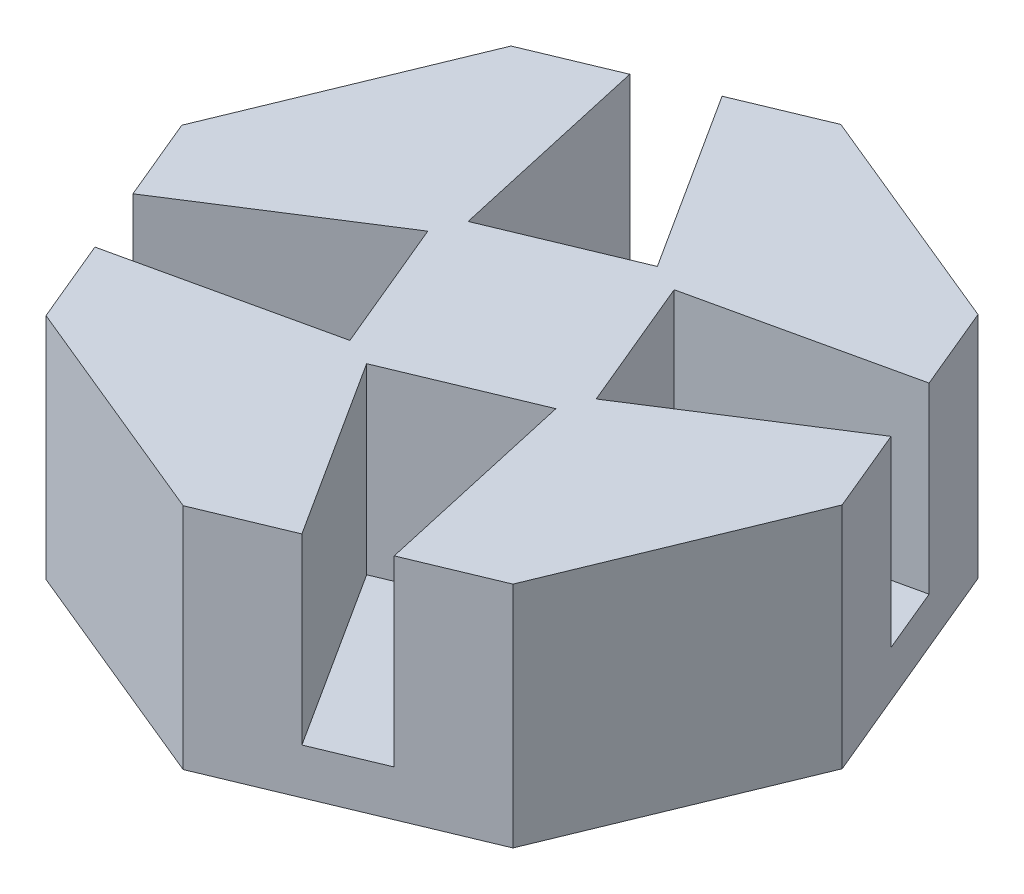
ISO-10303-21;
HEADER;
FILE_DESCRIPTION(('STEP AP214'),'2;1');
FILE_NAME('part.step','',(''),(''),'','','');
FILE_SCHEMA(('AUTOMOTIVE_DESIGN { 1 0 10303 214 1 1 1 1 }'));
ENDSEC;
DATA;
#1=APPLICATION_CONTEXT('core data for automotive mechanical design processes');
#2=APPLICATION_PROTOCOL_DEFINITION('international standard','automotive_design',2000,#1);
#3=PRODUCT_CONTEXT('',#1,'mechanical');
#4=PRODUCT('Part','Part','',(#3));
#5=PRODUCT_RELATED_PRODUCT_CATEGORY('part','',(#4));
#6=PRODUCT_DEFINITION_FORMATION('','',#4);
#7=PRODUCT_DEFINITION_CONTEXT('part definition',#1,'design');
#8=PRODUCT_DEFINITION('design','',#6,#7);
#9=PRODUCT_DEFINITION_SHAPE('','',#8);
#10=(LENGTH_UNIT() NAMED_UNIT(*) SI_UNIT(.MILLI.,.METRE.));
#11=(NAMED_UNIT(*) PLANE_ANGLE_UNIT() SI_UNIT($,.RADIAN.));
#12=(NAMED_UNIT(*) SI_UNIT($,.STERADIAN.) SOLID_ANGLE_UNIT());
#13=UNCERTAINTY_MEASURE_WITH_UNIT(LENGTH_MEASURE(1.E-05),#10,'distance_accuracy_value','');
#14=(GEOMETRIC_REPRESENTATION_CONTEXT(3) GLOBAL_UNCERTAINTY_ASSIGNED_CONTEXT((#13)) GLOBAL_UNIT_ASSIGNED_CONTEXT((#10,
#11,#12)) REPRESENTATION_CONTEXT('',''));
#15=CARTESIAN_POINT('',(0.,0.,0.));
#16=DIRECTION('',(0.,0.,1.));
#17=DIRECTION('',(1.,0.,0.));
#18=AXIS2_PLACEMENT_3D('',#15,#16,#17);
#19=CARTESIAN_POINT('',(-0.111992667325423,38.1,-54.9379232963896));
#20=DIRECTION('',(0.384565990508202,0.,0.923097502403969));
#21=DIRECTION('',(0.923097502403969,0.,-0.384565990508202));
#22=AXIS2_PLACEMENT_3D('',#19,#20,#21);
#23=PLANE('',#22);
#24=DIRECTION('',(0.,1.,0.));
#25=VECTOR('',#24,1.);
#26=CARTESIAN_POINT('',(-24.9509434148019,7.62000000000001,-44.5899203254017));
#27=LINE('',#26,#25);
#28=CARTESIAN_POINT('',(-24.9509434148019,7.62000000000001,-44.5899203254017));
#29=VERTEX_POINT('',#28);
#30=CARTESIAN_POINT('',(-24.9509434148019,38.1,-44.5899203254017));
#31=VERTEX_POINT('',#30);
#32=EDGE_CURVE('E248',#29,#31,#27,.T.);
#33=ORIENTED_EDGE('',*,*,#32,.F.);
#34=DIRECTION('',(-0.923097502403969,0.,0.384565990508202));
#35=VECTOR('',#34,1.);
#36=CARTESIAN_POINT('',(-19.5190807745089,7.62000000000001,-46.8528553145321));
#37=LINE('',#36,#35);
#38=CARTESIAN_POINT('',(-14.0872181342151,7.62000000000001,-49.1157903036627));
#39=VERTEX_POINT('',#38);
#40=EDGE_CURVE('E272',#39,#29,#37,.T.);
#41=ORIENTED_EDGE('',*,*,#40,.F.);
#42=DIRECTION('',(0.,1.,0.));
#43=VECTOR('',#42,1.);
#44=CARTESIAN_POINT('',(-14.0872181342151,7.62000000000001,-49.1157903036627));
#45=LINE('',#44,#43);
#46=CARTESIAN_POINT('',(-14.0872181342151,38.1,-49.1157903036627));
#47=VERTEX_POINT('',#46);
#48=EDGE_CURVE('E288',#39,#47,#45,.T.);
#49=ORIENTED_EDGE('',*,*,#48,.T.);
#50=DIRECTION('',(-0.923097502403969,0.,0.384565990508202));
#51=VECTOR('',#50,1.);
#52=CARTESIAN_POINT('',(-0.111992667325423,38.1,-54.9379232963896));
#53=LINE('',#52,#51);
#54=CARTESIAN_POINT('',(-0.111992667325423,38.1,-54.9379232963896));
#55=VERTEX_POINT('',#54);
#56=EDGE_CURVE('E379',#55,#47,#53,.T.);
#57=ORIENTED_EDGE('',*,*,#56,.F.);
#58=DIRECTION('',(0.,-1.,0.));
#59=VECTOR('',#58,1.);
#60=CARTESIAN_POINT('',(-0.111992667325423,38.1,-54.9379232963896));
#61=LINE('',#60,#59);
#62=CARTESIAN_POINT('',(-0.111992667325423,0.,-54.9379232963896));
#63=VERTEX_POINT('',#62);
#64=EDGE_CURVE('E11',#55,#63,#61,.T.);
#65=ORIENTED_EDGE('',*,*,#64,.T.);
#66=DIRECTION('',(-0.923097502403969,0.,0.384565990508202));
#67=VECTOR('',#66,1.);
#68=CARTESIAN_POINT('',(-0.111992667325423,0.,-54.9379232963896));
#69=LINE('',#68,#67);
#70=CARTESIAN_POINT('',(-38.9261688816924,0.,-38.7677873326745));
#71=VERTEX_POINT('',#70);
#72=EDGE_CURVE('E411',#63,#71,#69,.T.);
#73=ORIENTED_EDGE('',*,*,#72,.T.);
#74=DIRECTION('',(0.,-1.,0.));
#75=VECTOR('',#74,1.);
#76=CARTESIAN_POINT('',(-38.9261688816924,38.1,-38.7677873326745));
#77=LINE('',#76,#75);
#78=CARTESIAN_POINT('',(-38.9261688816924,38.1,-38.7677873326745));
#79=VERTEX_POINT('',#78);
#80=EDGE_CURVE('E54',#79,#71,#77,.T.);
#81=ORIENTED_EDGE('',*,*,#80,.F.);
#82=EDGE_CURVE('E377',#31,#79,#53,.T.);
#83=ORIENTED_EDGE('',*,*,#82,.F.);
#84=EDGE_LOOP('',(#33,#41,#49,#57,#65,#73,#81,#83));
#85=FACE_BOUND('',#84,.T.);
#86=ADVANCED_FACE('F45',(#85),#23,.F.);
#87=CARTESIAN_POINT('',(-54.9379232963896,38.1,0.111992667325427));
#88=DIRECTION('',(0.923097502403969,0.,-0.384565990508202));
#89=DIRECTION('',(-0.384565990508203,0.,-0.923097502403969));
#90=AXIS2_PLACEMENT_3D('',#87,#88,#89);
#91=PLANE('',#90);
#92=DIRECTION('',(0.,1.,0.));
#93=VECTOR('',#92,1.);
#94=CARTESIAN_POINT('',(-44.5899203254017,7.62000000000001,24.950943414802));
#95=LINE('',#94,#93);
#96=CARTESIAN_POINT('',(-44.5899203254017,7.62000000000001,24.950943414802));
#97=VERTEX_POINT('',#96);
#98=CARTESIAN_POINT('',(-44.5899203254017,38.1,24.950943414802));
#99=VERTEX_POINT('',#98);
#100=EDGE_CURVE('E251',#97,#99,#95,.T.);
#101=ORIENTED_EDGE('',*,*,#100,.F.);
#102=DIRECTION('',(0.384565990508203,0.,0.923097502403969));
#103=VECTOR('',#102,1.);
#104=CARTESIAN_POINT('',(-46.8528553145321,7.62000000000001,19.5190807745089));
#105=LINE('',#104,#103);
#106=CARTESIAN_POINT('',(-49.1157903036627,7.62000000000001,14.0872181342153));
#107=VERTEX_POINT('',#106);
#108=EDGE_CURVE('E230',#107,#97,#105,.T.);
#109=ORIENTED_EDGE('',*,*,#108,.F.);
#110=DIRECTION('',(0.,1.,0.));
#111=VECTOR('',#110,1.);
#112=CARTESIAN_POINT('',(-49.1157903036627,7.62000000000001,14.0872181342153));
#113=LINE('',#112,#111);
#114=CARTESIAN_POINT('',(-49.1157903036627,38.1,14.0872181342153));
#115=VERTEX_POINT('',#114);
#116=EDGE_CURVE('E255',#107,#115,#113,.T.);
#117=ORIENTED_EDGE('',*,*,#116,.T.);
#118=DIRECTION('',(0.384565990508203,0.,0.923097502403969));
#119=VECTOR('',#118,1.);
#120=CARTESIAN_POINT('',(-54.9379232963896,38.1,0.111992667325427));
#121=LINE('',#120,#119);
#122=CARTESIAN_POINT('',(-54.9379232963896,38.1,0.111992667325427));
#123=VERTEX_POINT('',#122);
#124=EDGE_CURVE('E387',#123,#115,#121,.T.);
#125=ORIENTED_EDGE('',*,*,#124,.F.);
#126=DIRECTION('',(0.,-1.,0.));
#127=VECTOR('',#126,1.);
#128=CARTESIAN_POINT('',(-54.9379232963896,38.1,0.111992667325427));
#129=LINE('',#128,#127);
#130=CARTESIAN_POINT('',(-54.9379232963896,0.,0.111992667325427));
#131=VERTEX_POINT('',#130);
#132=EDGE_CURVE('E450',#123,#131,#129,.T.);
#133=ORIENTED_EDGE('',*,*,#132,.T.);
#134=DIRECTION('',(0.384565990508203,0.,0.923097502403969));
#135=VECTOR('',#134,1.);
#136=CARTESIAN_POINT('',(-54.9379232963896,0.,0.111992667325427));
#137=LINE('',#136,#135);
#138=CARTESIAN_POINT('',(-38.7677873326745,0.,38.9261688816925));
#139=VERTEX_POINT('',#138);
#140=EDGE_CURVE('E417',#131,#139,#137,.T.);
#141=ORIENTED_EDGE('',*,*,#140,.T.);
#142=DIRECTION('',(0.,-1.,0.));
#143=VECTOR('',#142,1.);
#144=CARTESIAN_POINT('',(-38.7677873326745,38.1,38.9261688816925));
#145=LINE('',#144,#143);
#146=CARTESIAN_POINT('',(-38.7677873326745,38.1,38.9261688816925));
#147=VERTEX_POINT('',#146);
#148=EDGE_CURVE('E446',#147,#139,#145,.T.);
#149=ORIENTED_EDGE('',*,*,#148,.F.);
#150=EDGE_CURVE('E386',#99,#147,#121,.T.);
#151=ORIENTED_EDGE('',*,*,#150,.F.);
#152=EDGE_LOOP('',(#101,#109,#117,#125,#133,#141,#149,#151));
#153=FACE_BOUND('',#152,.T.);
#154=ADVANCED_FACE('F471',(#153),#91,.F.);
#155=CARTESIAN_POINT('',(0.111992667325429,38.1,54.9379232963896));
#156=DIRECTION('',(-0.384565990508203,0.,-0.923097502403969));
#157=DIRECTION('',(-0.923097502403969,0.,0.384565990508203));
#158=AXIS2_PLACEMENT_3D('',#155,#156,#157);
#159=PLANE('',#158);
#160=DIRECTION('',(0.,1.,0.));
#161=VECTOR('',#160,1.);
#162=CARTESIAN_POINT('',(24.9509434148022,7.62000000000001,44.5899203254016));
#163=LINE('',#162,#161);
#164=CARTESIAN_POINT('',(24.9509434148022,7.62000000000001,44.5899203254016));
#165=VERTEX_POINT('',#164);
#166=CARTESIAN_POINT('',(24.9509434148022,38.1,44.5899203254016));
#167=VERTEX_POINT('',#166);
#168=EDGE_CURVE('E363',#165,#167,#163,.T.);
#169=ORIENTED_EDGE('',*,*,#168,.F.);
#170=DIRECTION('',(0.923097502403969,0.,-0.384565990508203));
#171=VECTOR('',#170,1.);
#172=CARTESIAN_POINT('',(19.519080774509,7.62000000000001,46.8528553145321));
#173=LINE('',#172,#171);
#174=CARTESIAN_POINT('',(14.0872181342155,7.62000000000001,49.1157903036626));
#175=VERTEX_POINT('',#174);
#176=EDGE_CURVE('E341',#175,#165,#173,.T.);
#177=ORIENTED_EDGE('',*,*,#176,.F.);
#178=DIRECTION('',(0.,1.,0.));
#179=VECTOR('',#178,1.);
#180=CARTESIAN_POINT('',(14.0872181342155,7.62000000000001,49.1157903036626));
#181=LINE('',#180,#179);
#182=CARTESIAN_POINT('',(14.0872181342155,38.1,49.1157903036626));
#183=VERTEX_POINT('',#182);
#184=EDGE_CURVE('E366',#175,#183,#181,.T.);
#185=ORIENTED_EDGE('',*,*,#184,.T.);
#186=DIRECTION('',(0.923097502403969,0.,-0.384565990508203));
#187=VECTOR('',#186,1.);
#188=CARTESIAN_POINT('',(0.111992667325429,38.1,54.9379232963896));
#189=LINE('',#188,#187);
#190=CARTESIAN_POINT('',(0.111992667325429,38.1,54.9379232963896));
#191=VERTEX_POINT('',#190);
#192=EDGE_CURVE('E395',#191,#183,#189,.T.);
#193=ORIENTED_EDGE('',*,*,#192,.F.);
#194=DIRECTION('',(0.,-1.,0.));
#195=VECTOR('',#194,1.);
#196=CARTESIAN_POINT('',(0.111992667325429,38.1,54.9379232963896));
#197=LINE('',#196,#195);
#198=CARTESIAN_POINT('',(0.111992667325429,0.,54.9379232963896));
#199=VERTEX_POINT('',#198);
#200=EDGE_CURVE('E442',#191,#199,#197,.T.);
#201=ORIENTED_EDGE('',*,*,#200,.T.);
#202=DIRECTION('',(0.923097502403969,0.,-0.384565990508203));
#203=VECTOR('',#202,1.);
#204=CARTESIAN_POINT('',(0.111992667325429,0.,54.9379232963896));
#205=LINE('',#204,#203);
#206=CARTESIAN_POINT('',(38.9261688816925,0.,38.7677873326745));
#207=VERTEX_POINT('',#206);
#208=EDGE_CURVE('E423',#199,#207,#205,.T.);
#209=ORIENTED_EDGE('',*,*,#208,.T.);
#210=DIRECTION('',(0.,-1.,0.));
#211=VECTOR('',#210,1.);
#212=CARTESIAN_POINT('',(38.9261688816925,38.1,38.7677873326745));
#213=LINE('',#212,#211);
#214=CARTESIAN_POINT('',(38.9261688816925,38.1,38.7677873326745));
#215=VERTEX_POINT('',#214);
#216=EDGE_CURVE('E438',#215,#207,#213,.T.);
#217=ORIENTED_EDGE('',*,*,#216,.F.);
#218=EDGE_CURVE('E394',#167,#215,#189,.T.);
#219=ORIENTED_EDGE('',*,*,#218,.F.);
#220=EDGE_LOOP('',(#169,#177,#185,#193,#201,#209,#217,#219));
#221=FACE_BOUND('',#220,.T.);
#222=ADVANCED_FACE('F515',(#221),#159,.F.);
#223=CARTESIAN_POINT('',(54.9379232963896,38.1,-0.111992667325405));
#224=DIRECTION('',(-0.923097502403969,0.,0.384565990508202));
#225=DIRECTION('',(0.384565990508202,0.,0.923097502403969));
#226=AXIS2_PLACEMENT_3D('',#223,#224,#225);
#227=PLANE('',#226);
#228=DIRECTION('',(0.,1.,0.));
#229=VECTOR('',#228,1.);
#230=CARTESIAN_POINT('',(44.5899203254018,7.62000000000001,-24.9509434148017));
#231=LINE('',#230,#229);
#232=CARTESIAN_POINT('',(44.5899203254018,7.62000000000001,-24.9509434148017));
#233=VERTEX_POINT('',#232);
#234=CARTESIAN_POINT('',(44.5899203254018,38.1,-24.9509434148017));
#235=VERTEX_POINT('',#234);
#236=EDGE_CURVE('E280',#233,#235,#231,.T.);
#237=ORIENTED_EDGE('',*,*,#236,.F.);
#238=DIRECTION('',(-0.384565990508202,0.,-0.923097502403969));
#239=VECTOR('',#238,1.);
#240=CARTESIAN_POINT('',(46.8528553145321,7.62000000000001,-19.5190807745089));
#241=LINE('',#240,#239);
#242=CARTESIAN_POINT('',(49.1157903036628,7.62000000000001,-14.087218134215));
#243=VERTEX_POINT('',#242);
#244=EDGE_CURVE('E308',#243,#233,#241,.T.);
#245=ORIENTED_EDGE('',*,*,#244,.F.);
#246=DIRECTION('',(0.,1.,0.));
#247=VECTOR('',#246,1.);
#248=CARTESIAN_POINT('',(49.1157903036628,7.62000000000001,-14.087218134215));
#249=LINE('',#248,#247);
#250=CARTESIAN_POINT('',(49.1157903036628,38.1,-14.087218134215));
#251=VERTEX_POINT('',#250);
#252=EDGE_CURVE('E323',#243,#251,#249,.T.);
#253=ORIENTED_EDGE('',*,*,#252,.T.);
#254=DIRECTION('',(-0.384565990508202,0.,-0.923097502403969));
#255=VECTOR('',#254,1.);
#256=CARTESIAN_POINT('',(54.9379232963896,38.1,-0.111992667325405));
#257=LINE('',#256,#255);
#258=CARTESIAN_POINT('',(54.9379232963896,38.1,-0.111992667325405));
#259=VERTEX_POINT('',#258);
#260=EDGE_CURVE('E403',#259,#251,#257,.T.);
#261=ORIENTED_EDGE('',*,*,#260,.F.);
#262=DIRECTION('',(0.,-1.,0.));
#263=VECTOR('',#262,1.);
#264=CARTESIAN_POINT('',(54.9379232963896,38.1,-0.111992667325405));
#265=LINE('',#264,#263);
#266=CARTESIAN_POINT('',(54.9379232963896,0.,-0.111992667325405));
#267=VERTEX_POINT('',#266);
#268=EDGE_CURVE('E434',#259,#267,#265,.T.);
#269=ORIENTED_EDGE('',*,*,#268,.T.);
#270=DIRECTION('',(-0.384565990508202,0.,-0.923097502403969));
#271=VECTOR('',#270,1.);
#272=CARTESIAN_POINT('',(54.9379232963896,0.,-0.111992667325405));
#273=LINE('',#272,#271);
#274=CARTESIAN_POINT('',(38.7677873326746,0.,-38.9261688816924));
#275=VERTEX_POINT('',#274);
#276=EDGE_CURVE('E378',#267,#275,#273,.T.);
#277=ORIENTED_EDGE('',*,*,#276,.T.);
#278=DIRECTION('',(0.,-1.,0.));
#279=VECTOR('',#278,1.);
#280=CARTESIAN_POINT('',(38.7677873326746,38.1,-38.9261688816924));
#281=LINE('',#280,#279);
#282=CARTESIAN_POINT('',(38.7677873326746,38.1,-38.9261688816924));
#283=VERTEX_POINT('',#282);
#284=EDGE_CURVE('E407',#283,#275,#281,.T.);
#285=ORIENTED_EDGE('',*,*,#284,.F.);
#286=EDGE_CURVE('E402',#235,#283,#257,.T.);
#287=ORIENTED_EDGE('',*,*,#286,.F.);
#288=EDGE_LOOP('',(#237,#245,#253,#261,#269,#277,#285,#287));
#289=FACE_BOUND('',#288,.T.);
#290=ADVANCED_FACE('F505',(#289),#227,.F.);
#291=CARTESIAN_POINT('',(0.,38.1,0.));
#292=DIRECTION('',(0.,1.,0.));
#293=DIRECTION('',(0.,0.,1.));
#294=AXIS2_PLACEMENT_3D('',#291,#292,#293);
#295=PLANE('',#294);
#296=DIRECTION('',(-0.384565990508193,0.,-0.923097502403973));
#297=VECTOR('',#296,1.);
#298=CARTESIAN_POINT('',(14.4964416602682,38.1,-6.03927367521528));
#299=LINE('',#298,#297);
#300=CARTESIAN_POINT('',(19.1362303357496,38.1,5.09789769128866));
#301=VERTEX_POINT('',#300);
#302=CARTESIAN_POINT('',(9.85665298478688,38.1,-17.1764450417192));
#303=VERTEX_POINT('',#302);
#304=EDGE_CURVE('E315',#301,#303,#299,.T.);
#305=ORIENTED_EDGE('',*,*,#304,.T.);
#306=DIRECTION('',(0.975852760598064,0.,-0.218429369895939));
#307=VECTOR('',#306,1.);
#308=CARTESIAN_POINT('',(-3.19096887617111,38.1,-14.2559390629454));
#309=LINE('',#308,#307);
#310=EDGE_CURVE('E61',#303,#235,#309,.T.);
#311=ORIENTED_EDGE('',*,*,#310,.T.);
#312=ORIENTED_EDGE('',*,*,#286,.T.);
#313=DIRECTION('',(-0.924657723348283,0.,-0.38079928394414));
#314=VECTOR('',#313,1.);
#315=CARTESIAN_POINT('',(38.7677873326746,38.1,-38.9261688816924));
#316=LINE('',#315,#314);
#317=EDGE_CURVE('E373',#283,#55,#316,.T.);
#318=ORIENTED_EDGE('',*,*,#317,.T.);
#319=ORIENTED_EDGE('',*,*,#56,.T.);
#320=DIRECTION('',(-0.539017768098633,0.,-0.842294393709212));
#321=VECTOR('',#320,1.);
#322=CARTESIAN_POINT('',(12.3048251074475,38.1,-7.87434822764609));
#323=LINE('',#322,#321);
#324=CARTESIAN_POINT('',(5.09789769128859,38.1,-19.1362303357496));
#325=VERTEX_POINT('',#324);
#326=EDGE_CURVE('E265',#325,#47,#323,.T.);
#327=ORIENTED_EDGE('',*,*,#326,.F.);
#328=DIRECTION('',(-0.923097502403971,0.,0.384565990508196));
#329=VECTOR('',#328,1.);
#330=CARTESIAN_POINT('',(-6.03927367521533,38.1,-14.4964416602682));
#331=LINE('',#330,#329);
#332=CARTESIAN_POINT('',(-17.1764450417192,38.1,-9.85665298478682));
#333=VERTEX_POINT('',#332);
#334=EDGE_CURVE('E279',#325,#333,#331,.T.);
#335=ORIENTED_EDGE('',*,*,#334,.T.);
#336=DIRECTION('',(-0.218429369895943,0.,-0.975852760598064));
#337=VECTOR('',#336,1.);
#338=CARTESIAN_POINT('',(-14.2559390629454,38.1,3.19096887617116));
#339=LINE('',#338,#337);
#340=EDGE_CURVE('E69',#333,#31,#339,.T.);
#341=ORIENTED_EDGE('',*,*,#340,.T.);
#342=ORIENTED_EDGE('',*,*,#82,.T.);
#343=DIRECTION('',(-0.38079928394414,0.,0.924657723348283));
#344=VECTOR('',#343,1.);
#345=CARTESIAN_POINT('',(-38.9261688816924,38.1,-38.7677873326745));
#346=LINE('',#345,#344);
#347=EDGE_CURVE('E383',#79,#123,#346,.T.);
#348=ORIENTED_EDGE('',*,*,#347,.T.);
#349=ORIENTED_EDGE('',*,*,#124,.T.);
#350=DIRECTION('',(-0.84229439370921,0.,0.539017768098636));
#351=VECTOR('',#350,1.);
#352=CARTESIAN_POINT('',(-7.87434822764614,38.1,-12.3048251074475));
#353=LINE('',#352,#351);
#354=CARTESIAN_POINT('',(-19.1362303357496,38.1,-5.09789769128851));
#355=VERTEX_POINT('',#354);
#356=EDGE_CURVE('E236',#355,#115,#353,.T.);
#357=ORIENTED_EDGE('',*,*,#356,.F.);
#358=DIRECTION('',(0.384565990508199,0.,0.92309750240397));
#359=VECTOR('',#358,1.);
#360=CARTESIAN_POINT('',(-14.4964416602682,38.1,6.03927367521538));
#361=LINE('',#360,#359);
#362=CARTESIAN_POINT('',(-9.85665298478676,38.1,17.1764450417193));
#363=VERTEX_POINT('',#362);
#364=EDGE_CURVE('E239',#355,#363,#361,.T.);
#365=ORIENTED_EDGE('',*,*,#364,.T.);
#366=DIRECTION('',(-0.975852760598063,0.,0.218429369895946));
#367=VECTOR('',#366,1.);
#368=CARTESIAN_POINT('',(3.19096887617121,38.1,14.2559390629454));
#369=LINE('',#368,#367);
#370=EDGE_CURVE('E228',#363,#99,#369,.T.);
#371=ORIENTED_EDGE('',*,*,#370,.T.);
#372=ORIENTED_EDGE('',*,*,#150,.T.);
#373=DIRECTION('',(0.924657723348283,0.,0.38079928394414));
#374=VECTOR('',#373,1.);
#375=CARTESIAN_POINT('',(-38.7677873326745,38.1,38.9261688816925));
#376=LINE('',#375,#374);
#377=EDGE_CURVE('E391',#147,#191,#376,.T.);
#378=ORIENTED_EDGE('',*,*,#377,.T.);
#379=ORIENTED_EDGE('',*,*,#192,.T.);
#380=DIRECTION('',(0.539017768098639,0.,0.842294393709208));
#381=VECTOR('',#380,1.);
#382=CARTESIAN_POINT('',(-12.3048251074475,38.1,7.87434822764618));
#383=LINE('',#382,#381);
#384=CARTESIAN_POINT('',(-5.09789769128846,38.1,19.1362303357496));
#385=VERTEX_POINT('',#384);
#386=EDGE_CURVE('E352',#385,#183,#383,.T.);
#387=ORIENTED_EDGE('',*,*,#386,.F.);
#388=DIRECTION('',(0.923097502403969,0.,-0.384565990508203));
#389=VECTOR('',#388,1.);
#390=CARTESIAN_POINT('',(6.03927367521543,38.1,14.4964416602682));
#391=LINE('',#390,#389);
#392=CARTESIAN_POINT('',(17.1764450417193,38.1,9.8566529847867));
#393=VERTEX_POINT('',#392);
#394=EDGE_CURVE('E254',#385,#393,#391,.T.);
#395=ORIENTED_EDGE('',*,*,#394,.T.);
#396=DIRECTION('',(0.218429369895949,0.,0.975852760598062));
#397=VECTOR('',#396,1.);
#398=CARTESIAN_POINT('',(14.2559390629454,38.1,-3.19096887617126));
#399=LINE('',#398,#397);
#400=EDGE_CURVE('E337',#393,#167,#399,.T.);
#401=ORIENTED_EDGE('',*,*,#400,.T.);
#402=ORIENTED_EDGE('',*,*,#218,.T.);
#403=DIRECTION('',(0.38079928394414,0.,-0.924657723348283));
#404=VECTOR('',#403,1.);
#405=CARTESIAN_POINT('',(38.9261688816925,38.1,38.7677873326745));
#406=LINE('',#405,#404);
#407=EDGE_CURVE('E399',#215,#259,#406,.T.);
#408=ORIENTED_EDGE('',*,*,#407,.T.);
#409=ORIENTED_EDGE('',*,*,#260,.T.);
#410=DIRECTION('',(0.842294393709214,0.,-0.53901776809863));
#411=VECTOR('',#410,1.);
#412=CARTESIAN_POINT('',(7.87434822764605,38.1,12.3048251074475));
#413=LINE('',#412,#411);
#414=EDGE_CURVE('E301',#301,#251,#413,.T.);
#415=ORIENTED_EDGE('',*,*,#414,.F.);
#416=EDGE_LOOP('',(#305,#311,#312,#318,#319,#327,#335,#341,#342,#348,#349,#357,#365,#371,#372,
#378,#379,#387,#395,#401,#402,#408,#409,#415));
#417=FACE_BOUND('',#416,.T.);
#418=ADVANCED_FACE('F480',(#417),#295,.T.);
#419=CARTESIAN_POINT('',(38.7677873326746,38.1,-38.9261688816924));
#420=DIRECTION('',(-0.38079928394414,0.,0.924657723348283));
#421=DIRECTION('',(0.924657723348283,0.,0.38079928394414));
#422=AXIS2_PLACEMENT_3D('',#419,#420,#421);
#423=PLANE('',#422);
#424=DIRECTION('',(-0.924657723348283,0.,-0.38079928394414));
#425=VECTOR('',#424,1.);
#426=CARTESIAN_POINT('',(38.7677873326746,0.,-38.9261688816924));
#427=LINE('',#426,#425);
#428=EDGE_CURVE('E362',#275,#63,#427,.T.);
#429=ORIENTED_EDGE('',*,*,#428,.T.);
#430=ORIENTED_EDGE('',*,*,#64,.F.);
#431=ORIENTED_EDGE('',*,*,#317,.F.);
#432=ORIENTED_EDGE('',*,*,#284,.T.);
#433=EDGE_LOOP('',(#429,#430,#431,#432));
#434=FACE_BOUND('',#433,.T.);
#435=ADVANCED_FACE('F47',(#434),#423,.F.);
#436=CARTESIAN_POINT('',(-38.9261688816924,38.1,-38.7677873326745));
#437=DIRECTION('',(0.924657723348283,0.,0.38079928394414));
#438=DIRECTION('',(0.38079928394414,0.,-0.924657723348283));
#439=AXIS2_PLACEMENT_3D('',#436,#437,#438);
#440=PLANE('',#439);
#441=DIRECTION('',(-0.38079928394414,0.,0.924657723348283));
#442=VECTOR('',#441,1.);
#443=CARTESIAN_POINT('',(-38.9261688816924,0.,-38.7677873326745));
#444=LINE('',#443,#442);
#445=EDGE_CURVE('E414',#71,#131,#444,.T.);
#446=ORIENTED_EDGE('',*,*,#445,.T.);
#447=ORIENTED_EDGE('',*,*,#132,.F.);
#448=ORIENTED_EDGE('',*,*,#347,.F.);
#449=ORIENTED_EDGE('',*,*,#80,.T.);
#450=EDGE_LOOP('',(#446,#447,#448,#449));
#451=FACE_BOUND('',#450,.T.);
#452=ADVANCED_FACE('F459',(#451),#440,.F.);
#453=CARTESIAN_POINT('',(-38.7677873326745,38.1,38.9261688816925));
#454=DIRECTION('',(0.38079928394414,0.,-0.924657723348283));
#455=DIRECTION('',(-0.924657723348283,0.,-0.38079928394414));
#456=AXIS2_PLACEMENT_3D('',#453,#454,#455);
#457=PLANE('',#456);
#458=DIRECTION('',(0.924657723348283,0.,0.38079928394414));
#459=VECTOR('',#458,1.);
#460=CARTESIAN_POINT('',(-38.7677873326745,0.,38.9261688816925));
#461=LINE('',#460,#459);
#462=EDGE_CURVE('E420',#139,#199,#461,.T.);
#463=ORIENTED_EDGE('',*,*,#462,.T.);
#464=ORIENTED_EDGE('',*,*,#200,.F.);
#465=ORIENTED_EDGE('',*,*,#377,.F.);
#466=ORIENTED_EDGE('',*,*,#148,.T.);
#467=EDGE_LOOP('',(#463,#464,#465,#466));
#468=FACE_BOUND('',#467,.T.);
#469=ADVANCED_FACE('F476',(#468),#457,.F.);
#470=CARTESIAN_POINT('',(38.9261688816925,38.1,38.7677873326745));
#471=DIRECTION('',(-0.924657723348283,0.,-0.38079928394414));
#472=DIRECTION('',(-0.38079928394414,0.,0.924657723348283));
#473=AXIS2_PLACEMENT_3D('',#470,#471,#472);
#474=PLANE('',#473);
#475=DIRECTION('',(0.38079928394414,0.,-0.924657723348283));
#476=VECTOR('',#475,1.);
#477=CARTESIAN_POINT('',(38.9261688816925,0.,38.7677873326745));
#478=LINE('',#477,#476);
#479=EDGE_CURVE('E426',#207,#267,#478,.T.);
#480=ORIENTED_EDGE('',*,*,#479,.T.);
#481=ORIENTED_EDGE('',*,*,#268,.F.);
#482=ORIENTED_EDGE('',*,*,#407,.F.);
#483=ORIENTED_EDGE('',*,*,#216,.T.);
#484=EDGE_LOOP('',(#480,#481,#482,#483));
#485=FACE_BOUND('',#484,.T.);
#486=ADVANCED_FACE('F510',(#485),#474,.F.);
#487=CARTESIAN_POINT('',(0.,0.,0.));
#488=DIRECTION('',(0.,1.,0.));
#489=DIRECTION('',(0.,0.,1.));
#490=AXIS2_PLACEMENT_3D('',#487,#488,#489);
#491=PLANE('',#490);
#492=ORIENTED_EDGE('',*,*,#428,.F.);
#493=ORIENTED_EDGE('',*,*,#276,.F.);
#494=ORIENTED_EDGE('',*,*,#479,.F.);
#495=ORIENTED_EDGE('',*,*,#208,.F.);
#496=ORIENTED_EDGE('',*,*,#462,.F.);
#497=ORIENTED_EDGE('',*,*,#140,.F.);
#498=ORIENTED_EDGE('',*,*,#445,.F.);
#499=ORIENTED_EDGE('',*,*,#72,.F.);
#500=EDGE_LOOP('',(#492,#493,#494,#495,#496,#497,#498,#499));
#501=FACE_BOUND('',#500,.T.);
#502=ADVANCED_FACE('F466',(#501),#491,.F.);
#503=CARTESIAN_POINT('',(6.03927367521543,7.62000000000001,14.4964416602682));
#504=DIRECTION('',(0.384565990508203,0.,0.923097502403969));
#505=DIRECTION('',(0.923097502403969,0.,-0.384565990508203));
#506=AXIS2_PLACEMENT_3D('',#503,#504,#505);
#507=PLANE('',#506);
#508=ORIENTED_EDGE('',*,*,#394,.F.);
#509=DIRECTION('',(0.,1.,0.));
#510=VECTOR('',#509,1.);
#511=CARTESIAN_POINT('',(-5.09789769128845,7.62000000000001,19.1362303357496));
#512=LINE('',#511,#510);
#513=CARTESIAN_POINT('',(-5.09789769128845,7.62000000000001,19.1362303357496));
#514=VERTEX_POINT('',#513);
#515=EDGE_CURVE('E348',#514,#385,#512,.T.);
#516=ORIENTED_EDGE('',*,*,#515,.F.);
#517=DIRECTION('',(0.923097502403969,0.,-0.384565990508203));
#518=VECTOR('',#517,1.);
#519=CARTESIAN_POINT('',(6.03927367521543,7.62000000000001,14.4964416602682));
#520=LINE('',#519,#518);
#521=CARTESIAN_POINT('',(17.1764450417193,7.62000000000001,9.8566529847867));
#522=VERTEX_POINT('',#521);
#523=EDGE_CURVE('E332',#514,#522,#520,.T.);
#524=ORIENTED_EDGE('',*,*,#523,.T.);
#525=DIRECTION('',(0.,1.,0.));
#526=VECTOR('',#525,1.);
#527=CARTESIAN_POINT('',(17.1764450417193,7.62000000000001,9.8566529847867));
#528=LINE('',#527,#526);
#529=EDGE_CURVE('E358',#522,#393,#528,.T.);
#530=ORIENTED_EDGE('',*,*,#529,.T.);
#531=EDGE_LOOP('',(#508,#516,#524,#530));
#532=FACE_BOUND('',#531,.T.);
#533=ADVANCED_FACE('F525',(#532),#507,.T.);
#534=CARTESIAN_POINT('',(14.2559390629454,7.62000000000001,-3.19096887617126));
#535=DIRECTION('',(-0.975852760598062,0.,0.218429369895949));
#536=DIRECTION('',(0.218429369895949,0.,0.975852760598062));
#537=AXIS2_PLACEMENT_3D('',#534,#535,#536);
#538=PLANE('',#537);
#539=ORIENTED_EDGE('',*,*,#400,.F.);
#540=ORIENTED_EDGE('',*,*,#529,.F.);
#541=DIRECTION('',(0.218429369895949,0.,0.975852760598062));
#542=VECTOR('',#541,1.);
#543=CARTESIAN_POINT('',(14.2559390629454,7.62000000000001,-3.19096887617126));
#544=LINE('',#543,#542);
#545=EDGE_CURVE('E345',#522,#165,#544,.T.);
#546=ORIENTED_EDGE('',*,*,#545,.T.);
#547=ORIENTED_EDGE('',*,*,#168,.T.);
#548=EDGE_LOOP('',(#539,#540,#546,#547));
#549=FACE_BOUND('',#548,.T.);
#550=ADVANCED_FACE('F527',(#549),#538,.T.);
#551=CARTESIAN_POINT('',(-12.3048251074475,7.62000000000001,7.87434822764618));
#552=DIRECTION('',(-0.842294393709208,0.,0.539017768098639));
#553=DIRECTION('',(0.539017768098639,0.,0.842294393709208));
#554=AXIS2_PLACEMENT_3D('',#551,#552,#553);
#555=PLANE('',#554);
#556=ORIENTED_EDGE('',*,*,#386,.T.);
#557=ORIENTED_EDGE('',*,*,#184,.F.);
#558=DIRECTION('',(0.539017768098639,0.,0.842294393709208));
#559=VECTOR('',#558,1.);
#560=CARTESIAN_POINT('',(-12.3048251074475,7.62000000000001,7.87434822764618));
#561=LINE('',#560,#559);
#562=EDGE_CURVE('E336',#514,#175,#561,.T.);
#563=ORIENTED_EDGE('',*,*,#562,.F.);
#564=ORIENTED_EDGE('',*,*,#515,.T.);
#565=EDGE_LOOP('',(#556,#557,#563,#564));
#566=FACE_BOUND('',#565,.T.);
#567=ADVANCED_FACE('F519',(#566),#555,.F.);
#568=CARTESIAN_POINT('',(0.,7.62000000000001,0.));
#569=DIRECTION('',(0.,1.,0.));
#570=DIRECTION('',(0.,0.,1.));
#571=AXIS2_PLACEMENT_3D('',#568,#569,#570);
#572=PLANE('',#571);
#573=ORIENTED_EDGE('',*,*,#523,.F.);
#574=ORIENTED_EDGE('',*,*,#562,.T.);
#575=ORIENTED_EDGE('',*,*,#176,.T.);
#576=ORIENTED_EDGE('',*,*,#545,.F.);
#577=EDGE_LOOP('',(#573,#574,#575,#576));
#578=FACE_BOUND('',#577,.T.);
#579=ADVANCED_FACE('F522',(#578),#572,.T.);
#580=CARTESIAN_POINT('',(3.19096887617121,7.62000000000001,14.2559390629454));
#581=DIRECTION('',(-0.218429369895946,0.,-0.975852760598063));
#582=DIRECTION('',(-0.975852760598063,0.,0.218429369895946));
#583=AXIS2_PLACEMENT_3D('',#580,#581,#582);
#584=PLANE('',#583);
#585=ORIENTED_EDGE('',*,*,#370,.F.);
#586=DIRECTION('',(0.,1.,0.));
#587=VECTOR('',#586,1.);
#588=CARTESIAN_POINT('',(-9.85665298478676,7.62000000000001,17.1764450417193));
#589=LINE('',#588,#587);
#590=CARTESIAN_POINT('',(-9.85665298478676,7.62000000000001,17.1764450417193));
#591=VERTEX_POINT('',#590);
#592=EDGE_CURVE('E213',#591,#363,#589,.T.);
#593=ORIENTED_EDGE('',*,*,#592,.F.);
#594=DIRECTION('',(-0.975852760598063,0.,0.218429369895946));
#595=VECTOR('',#594,1.);
#596=CARTESIAN_POINT('',(3.19096887617121,7.62000000000001,14.2559390629454));
#597=LINE('',#596,#595);
#598=EDGE_CURVE('E222',#591,#97,#597,.T.);
#599=ORIENTED_EDGE('',*,*,#598,.T.);
#600=ORIENTED_EDGE('',*,*,#100,.T.);
#601=EDGE_LOOP('',(#585,#593,#599,#600));
#602=FACE_BOUND('',#601,.T.);
#603=ADVANCED_FACE('F225',(#602),#584,.T.);
#604=CARTESIAN_POINT('',(-7.87434822764614,7.62000000000001,-12.3048251074475));
#605=DIRECTION('',(-0.539017768098636,0.,-0.84229439370921));
#606=DIRECTION('',(-0.84229439370921,0.,0.539017768098636));
#607=AXIS2_PLACEMENT_3D('',#604,#605,#606);
#608=PLANE('',#607);
#609=ORIENTED_EDGE('',*,*,#356,.T.);
#610=ORIENTED_EDGE('',*,*,#116,.F.);
#611=DIRECTION('',(-0.84229439370921,0.,0.539017768098636));
#612=VECTOR('',#611,1.);
#613=CARTESIAN_POINT('',(-7.87434822764614,7.62000000000001,-12.3048251074475));
#614=LINE('',#613,#612);
#615=CARTESIAN_POINT('',(-19.1362303357496,7.62000000000001,-5.09789769128851));
#616=VERTEX_POINT('',#615);
#617=EDGE_CURVE('E221',#616,#107,#614,.T.);
#618=ORIENTED_EDGE('',*,*,#617,.F.);
#619=DIRECTION('',(0.,1.,0.));
#620=VECTOR('',#619,1.);
#621=CARTESIAN_POINT('',(-19.1362303357496,7.62000000000001,-5.09789769128851));
#622=LINE('',#621,#620);
#623=EDGE_CURVE('E215',#616,#355,#622,.T.);
#624=ORIENTED_EDGE('',*,*,#623,.T.);
#625=EDGE_LOOP('',(#609,#610,#618,#624));
#626=FACE_BOUND('',#625,.T.);
#627=ADVANCED_FACE('F583',(#626),#608,.F.);
#628=CARTESIAN_POINT('',(-14.4964416602682,7.62000000000001,6.03927367521538));
#629=DIRECTION('',(-0.92309750240397,0.,0.384565990508199));
#630=DIRECTION('',(0.384565990508199,0.,0.92309750240397));
#631=AXIS2_PLACEMENT_3D('',#628,#629,#630);
#632=PLANE('',#631);
#633=ORIENTED_EDGE('',*,*,#364,.F.);
#634=ORIENTED_EDGE('',*,*,#623,.F.);
#635=DIRECTION('',(0.384565990508199,0.,0.92309750240397));
#636=VECTOR('',#635,1.);
#637=CARTESIAN_POINT('',(-14.4964416602682,7.62000000000001,6.03927367521538));
#638=LINE('',#637,#636);
#639=EDGE_CURVE('E209',#616,#591,#638,.T.);
#640=ORIENTED_EDGE('',*,*,#639,.T.);
#641=ORIENTED_EDGE('',*,*,#592,.T.);
#642=EDGE_LOOP('',(#633,#634,#640,#641));
#643=FACE_BOUND('',#642,.T.);
#644=ADVANCED_FACE('F212',(#643),#632,.T.);
#645=CARTESIAN_POINT('',(0.,7.62000000000001,0.));
#646=DIRECTION('',(0.,1.,0.));
#647=DIRECTION('',(0.,0.,1.));
#648=AXIS2_PLACEMENT_3D('',#645,#646,#647);
#649=PLANE('',#648);
#650=ORIENTED_EDGE('',*,*,#598,.F.);
#651=ORIENTED_EDGE('',*,*,#639,.F.);
#652=ORIENTED_EDGE('',*,*,#617,.T.);
#653=ORIENTED_EDGE('',*,*,#108,.T.);
#654=EDGE_LOOP('',(#650,#651,#652,#653));
#655=FACE_BOUND('',#654,.T.);
#656=ADVANCED_FACE('F232',(#655),#649,.T.);
#657=CARTESIAN_POINT('',(-14.2559390629454,7.62000000000001,3.19096887617116));
#658=DIRECTION('',(0.975852760598063,0.,-0.218429369895943));
#659=DIRECTION('',(-0.218429369895943,0.,-0.975852760598063));
#660=AXIS2_PLACEMENT_3D('',#657,#658,#659);
#661=PLANE('',#660);
#662=ORIENTED_EDGE('',*,*,#340,.F.);
#663=DIRECTION('',(0.,1.,0.));
#664=VECTOR('',#663,1.);
#665=CARTESIAN_POINT('',(-17.1764450417192,7.62000000000001,-9.85665298478681));
#666=LINE('',#665,#664);
#667=CARTESIAN_POINT('',(-17.1764450417192,7.62000000000001,-9.85665298478681));
#668=VERTEX_POINT('',#667);
#669=EDGE_CURVE('E276',#668,#333,#666,.T.);
#670=ORIENTED_EDGE('',*,*,#669,.F.);
#671=DIRECTION('',(-0.218429369895943,0.,-0.975852760598064));
#672=VECTOR('',#671,1.);
#673=CARTESIAN_POINT('',(-14.2559390629454,7.62000000000001,3.19096887617116));
#674=LINE('',#673,#672);
#675=EDGE_CURVE('E261',#668,#29,#674,.T.);
#676=ORIENTED_EDGE('',*,*,#675,.T.);
#677=ORIENTED_EDGE('',*,*,#32,.T.);
#678=EDGE_LOOP('',(#662,#670,#676,#677));
#679=FACE_BOUND('',#678,.T.);
#680=ADVANCED_FACE('F486',(#679),#661,.T.);
#681=CARTESIAN_POINT('',(12.3048251074475,7.62000000000001,-7.87434822764609));
#682=DIRECTION('',(0.842294393709212,0.,-0.539017768098633));
#683=DIRECTION('',(-0.539017768098633,0.,-0.842294393709212));
#684=AXIS2_PLACEMENT_3D('',#681,#682,#683);
#685=PLANE('',#684);
#686=ORIENTED_EDGE('',*,*,#326,.T.);
#687=ORIENTED_EDGE('',*,*,#48,.F.);
#688=DIRECTION('',(-0.539017768098633,0.,-0.842294393709212));
#689=VECTOR('',#688,1.);
#690=CARTESIAN_POINT('',(12.3048251074475,7.62000000000001,-7.87434822764609));
#691=LINE('',#690,#689);
#692=CARTESIAN_POINT('',(5.09789769128859,7.62000000000001,-19.1362303357496));
#693=VERTEX_POINT('',#692);
#694=EDGE_CURVE('E268',#693,#39,#691,.T.);
#695=ORIENTED_EDGE('',*,*,#694,.F.);
#696=DIRECTION('',(0.,1.,0.));
#697=VECTOR('',#696,1.);
#698=CARTESIAN_POINT('',(5.09789769128859,7.62000000000001,-19.1362303357496));
#699=LINE('',#698,#697);
#700=EDGE_CURVE('E292',#693,#325,#699,.T.);
#701=ORIENTED_EDGE('',*,*,#700,.T.);
#702=EDGE_LOOP('',(#686,#687,#695,#701));
#703=FACE_BOUND('',#702,.T.);
#704=ADVANCED_FACE('F493',(#703),#685,.F.);
#705=CARTESIAN_POINT('',(-6.03927367521533,7.62000000000001,-14.4964416602682));
#706=DIRECTION('',(-0.384565990508196,0.,-0.923097502403971));
#707=DIRECTION('',(-0.923097502403971,0.,0.384565990508196));
#708=AXIS2_PLACEMENT_3D('',#705,#706,#707);
#709=PLANE('',#708);
#710=ORIENTED_EDGE('',*,*,#334,.F.);
#711=ORIENTED_EDGE('',*,*,#700,.F.);
#712=DIRECTION('',(-0.923097502403971,0.,0.384565990508196));
#713=VECTOR('',#712,1.);
#714=CARTESIAN_POINT('',(-6.03927367521533,7.62000000000001,-14.4964416602682));
#715=LINE('',#714,#713);
#716=EDGE_CURVE('E264',#693,#668,#715,.T.);
#717=ORIENTED_EDGE('',*,*,#716,.T.);
#718=ORIENTED_EDGE('',*,*,#669,.T.);
#719=EDGE_LOOP('',(#710,#711,#717,#718));
#720=FACE_BOUND('',#719,.T.);
#721=ADVANCED_FACE('F550',(#720),#709,.T.);
#722=CARTESIAN_POINT('',(0.,7.62000000000001,0.));
#723=DIRECTION('',(0.,1.,0.));
#724=DIRECTION('',(0.,0.,1.));
#725=AXIS2_PLACEMENT_3D('',#722,#723,#724);
#726=PLANE('',#725);
#727=ORIENTED_EDGE('',*,*,#675,.F.);
#728=ORIENTED_EDGE('',*,*,#716,.F.);
#729=ORIENTED_EDGE('',*,*,#694,.T.);
#730=ORIENTED_EDGE('',*,*,#40,.T.);
#731=EDGE_LOOP('',(#727,#728,#729,#730));
#732=FACE_BOUND('',#731,.T.);
#733=ADVANCED_FACE('F490',(#732),#726,.T.);
#734=CARTESIAN_POINT('',(-3.19096887617111,7.62000000000001,-14.2559390629454));
#735=DIRECTION('',(0.218429369895939,0.,0.975852760598064));
#736=DIRECTION('',(0.975852760598064,0.,-0.218429369895939));
#737=AXIS2_PLACEMENT_3D('',#734,#735,#736);
#738=PLANE('',#737);
#739=ORIENTED_EDGE('',*,*,#310,.F.);
#740=DIRECTION('',(0.,1.,0.));
#741=VECTOR('',#740,1.);
#742=CARTESIAN_POINT('',(9.85665298478688,7.62000000000001,-17.1764450417192));
#743=LINE('',#742,#741);
#744=CARTESIAN_POINT('',(9.85665298478688,7.62000000000001,-17.1764450417192));
#745=VERTEX_POINT('',#744);
#746=EDGE_CURVE('E312',#745,#303,#743,.T.);
#747=ORIENTED_EDGE('',*,*,#746,.F.);
#748=DIRECTION('',(0.975852760598064,0.,-0.218429369895939));
#749=VECTOR('',#748,1.);
#750=CARTESIAN_POINT('',(-3.19096887617111,7.62000000000001,-14.2559390629454));
#751=LINE('',#750,#749);
#752=EDGE_CURVE('E297',#745,#233,#751,.T.);
#753=ORIENTED_EDGE('',*,*,#752,.T.);
#754=ORIENTED_EDGE('',*,*,#236,.T.);
#755=EDGE_LOOP('',(#739,#747,#753,#754));
#756=FACE_BOUND('',#755,.T.);
#757=ADVANCED_FACE('F542',(#756),#738,.T.);
#758=CARTESIAN_POINT('',(7.87434822764605,7.62000000000001,12.3048251074475));
#759=DIRECTION('',(0.53901776809863,0.,0.842294393709214));
#760=DIRECTION('',(0.842294393709214,0.,-0.53901776809863));
#761=AXIS2_PLACEMENT_3D('',#758,#759,#760);
#762=PLANE('',#761);
#763=ORIENTED_EDGE('',*,*,#414,.T.);
#764=ORIENTED_EDGE('',*,*,#252,.F.);
#765=DIRECTION('',(0.842294393709214,0.,-0.53901776809863));
#766=VECTOR('',#765,1.);
#767=CARTESIAN_POINT('',(7.87434822764605,7.62000000000001,12.3048251074475));
#768=LINE('',#767,#766);
#769=CARTESIAN_POINT('',(19.1362303357496,7.62000000000001,5.09789769128866));
#770=VERTEX_POINT('',#769);
#771=EDGE_CURVE('E304',#770,#243,#768,.T.);
#772=ORIENTED_EDGE('',*,*,#771,.F.);
#773=DIRECTION('',(0.,1.,0.));
#774=VECTOR('',#773,1.);
#775=CARTESIAN_POINT('',(19.1362303357496,7.62000000000001,5.09789769128866));
#776=LINE('',#775,#774);
#777=EDGE_CURVE('E327',#770,#301,#776,.T.);
#778=ORIENTED_EDGE('',*,*,#777,.T.);
#779=EDGE_LOOP('',(#763,#764,#772,#778));
#780=FACE_BOUND('',#779,.T.);
#781=ADVANCED_FACE('F533',(#780),#762,.F.);
#782=CARTESIAN_POINT('',(14.4964416602682,7.62000000000001,-6.03927367521528));
#783=DIRECTION('',(0.923097502403973,0.,-0.384565990508193));
#784=DIRECTION('',(-0.384565990508193,0.,-0.923097502403973));
#785=AXIS2_PLACEMENT_3D('',#782,#783,#784);
#786=PLANE('',#785);
#787=ORIENTED_EDGE('',*,*,#304,.F.);
#788=ORIENTED_EDGE('',*,*,#777,.F.);
#789=DIRECTION('',(-0.384565990508193,0.,-0.923097502403973));
#790=VECTOR('',#789,1.);
#791=CARTESIAN_POINT('',(14.4964416602682,7.62000000000001,-6.03927367521528));
#792=LINE('',#791,#790);
#793=EDGE_CURVE('E300',#770,#745,#792,.T.);
#794=ORIENTED_EDGE('',*,*,#793,.T.);
#795=ORIENTED_EDGE('',*,*,#746,.T.);
#796=EDGE_LOOP('',(#787,#788,#794,#795));
#797=FACE_BOUND('',#796,.T.);
#798=ADVANCED_FACE('F541',(#797),#786,.T.);
#799=CARTESIAN_POINT('',(0.,7.62000000000001,0.));
#800=DIRECTION('',(0.,1.,0.));
#801=DIRECTION('',(0.,0.,1.));
#802=AXIS2_PLACEMENT_3D('',#799,#800,#801);
#803=PLANE('',#802);
#804=ORIENTED_EDGE('',*,*,#752,.F.);
#805=ORIENTED_EDGE('',*,*,#793,.F.);
#806=ORIENTED_EDGE('',*,*,#771,.T.);
#807=ORIENTED_EDGE('',*,*,#244,.T.);
#808=EDGE_LOOP('',(#804,#805,#806,#807));
#809=FACE_BOUND('',#808,.T.);
#810=ADVANCED_FACE('F538',(#809),#803,.T.);
#811=CLOSED_SHELL('',(#86,#154,#222,#290,#418,#435,#452,#469,#486,#502,#533,#550,#567,#579,#603,
#627,#644,#656,#680,#704,#721,#733,#757,#781,#798,#810));
#812=MANIFOLD_SOLID_BREP('B2',#811);
#813=ADVANCED_BREP_SHAPE_REPRESENTATION('',(#18,#812),#14);
#814=SHAPE_DEFINITION_REPRESENTATION(#9,#813);
ENDSEC;
END-ISO-10303-21;
